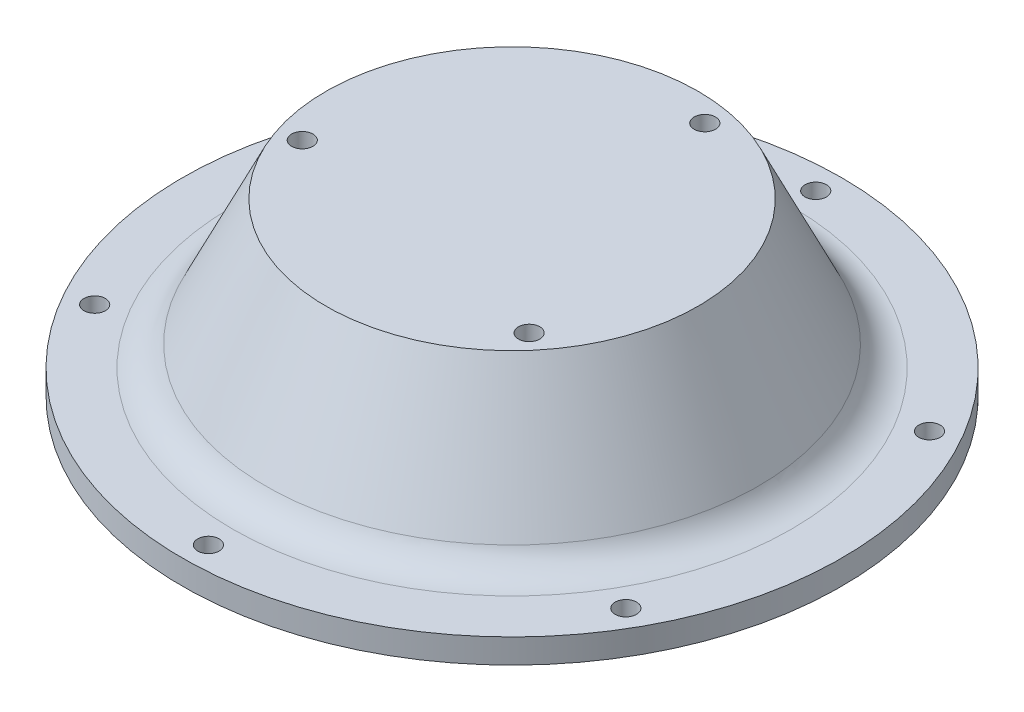
ISO-10303-21;
HEADER;
FILE_DESCRIPTION(('STEP AP214'),'2;1');
FILE_NAME('part.step','',(''),(''),'','','');
FILE_SCHEMA(('AUTOMOTIVE_DESIGN { 1 0 10303 214 1 1 1 1 }'));
ENDSEC;
DATA;
#1=APPLICATION_CONTEXT('core data for automotive mechanical design processes');
#2=APPLICATION_PROTOCOL_DEFINITION('international standard','automotive_design',2000,#1);
#3=PRODUCT_CONTEXT('',#1,'mechanical');
#4=PRODUCT('Part','Part','',(#3));
#5=PRODUCT_RELATED_PRODUCT_CATEGORY('part','',(#4));
#6=PRODUCT_DEFINITION_FORMATION('','',#4);
#7=PRODUCT_DEFINITION_CONTEXT('part definition',#1,'design');
#8=PRODUCT_DEFINITION('design','',#6,#7);
#9=PRODUCT_DEFINITION_SHAPE('','',#8);
#10=(LENGTH_UNIT() NAMED_UNIT(*) SI_UNIT(.MILLI.,.METRE.));
#11=(NAMED_UNIT(*) PLANE_ANGLE_UNIT() SI_UNIT($,.RADIAN.));
#12=(NAMED_UNIT(*) SI_UNIT($,.STERADIAN.) SOLID_ANGLE_UNIT());
#13=UNCERTAINTY_MEASURE_WITH_UNIT(LENGTH_MEASURE(1.E-05),#10,'distance_accuracy_value','');
#14=(GEOMETRIC_REPRESENTATION_CONTEXT(3) GLOBAL_UNCERTAINTY_ASSIGNED_CONTEXT((#13)) GLOBAL_UNIT_ASSIGNED_CONTEXT((#10,
#11,#12)) REPRESENTATION_CONTEXT('',''));
#15=CARTESIAN_POINT('',(0.,0.,0.));
#16=DIRECTION('',(0.,0.,1.));
#17=DIRECTION('',(1.,0.,0.));
#18=AXIS2_PLACEMENT_3D('',#15,#16,#17);
#19=CARTESIAN_POINT('',(42.,24.,0.));
#20=DIRECTION('',(0.,-1.,0.));
#21=DIRECTION('',(0.,0.,-1.));
#22=AXIS2_PLACEMENT_3D('',#19,#20,#21);
#23=CONICAL_SURFACE('',#22,30.5,0.446842468485764);
#24=CARTESIAN_POINT('',(42.,3.40727891741668,0.));
#25=DIRECTION('',(0.,-1.,0.));
#26=DIRECTION('',(0.,0.,-1.));
#27=AXIS2_PLACEMENT_3D('',#24,#25,#26);
#28=CIRCLE('',#27,40.3673455187378);
#29=CARTESIAN_POINT('',(42.,3.40727891741668,-40.3673455187378));
#30=VERTEX_POINT('',#29);
#31=EDGE_CURVE('E10',#30,#30,#28,.F.);
#32=ORIENTED_EDGE('',*,*,#31,.T.);
#33=EDGE_LOOP('',(#32));
#34=FACE_BOUND('',#33,.T.);
#35=CARTESIAN_POINT('',(42.,24.,0.));
#36=DIRECTION('',(0.,-1.,0.));
#37=DIRECTION('',(0.,0.,-1.));
#38=AXIS2_PLACEMENT_3D('',#35,#36,#37);
#39=CIRCLE('',#38,30.5);
#40=CARTESIAN_POINT('',(42.,24.,-30.5));
#41=VERTEX_POINT('',#40);
#42=EDGE_CURVE('E44',#41,#41,#39,.T.);
#43=ORIENTED_EDGE('',*,*,#42,.T.);
#44=EDGE_LOOP('',(#43));
#45=FACE_BOUND('',#44,.T.);
#46=ADVANCED_FACE('F31',(#34,#45),#23,.T.);
#47=CARTESIAN_POINT('',(42.,24.,0.));
#48=DIRECTION('',(0.,-1.,0.));
#49=DIRECTION('',(0.,0.,-1.));
#50=AXIS2_PLACEMENT_3D('',#47,#48,#49);
#51=PLANE('',#50);
#52=CARTESIAN_POINT('',(16.5017606514193,24.,8.87917733365499));
#53=DIRECTION('',(0.,1.,0.));
#54=DIRECTION('',(0.,0.,1.));
#55=AXIS2_PLACEMENT_3D('',#52,#53,#54);
#56=CIRCLE('',#55,1.74999999999893);
#57=CARTESIAN_POINT('',(16.5017606514193,24.,10.6291773336539));
#58=VERTEX_POINT('',#57);
#59=EDGE_CURVE('E51',#58,#58,#56,.T.);
#60=ORIENTED_EDGE('',*,*,#59,.F.);
#61=EDGE_LOOP('',(#60));
#62=FACE_BOUND('',#61,.T.);
#63=CARTESIAN_POINT('',(62.4387128099426,24.,17.6425343608193));
#64=DIRECTION('',(0.,1.,0.));
#65=DIRECTION('',(0.,0.,1.));
#66=AXIS2_PLACEMENT_3D('',#63,#64,#65);
#67=CIRCLE('',#66,1.74999999999946);
#68=CARTESIAN_POINT('',(62.4387128099426,24.,19.3925343608188));
#69=VERTEX_POINT('',#68);
#70=EDGE_CURVE('E171',#69,#69,#67,.T.);
#71=ORIENTED_EDGE('',*,*,#70,.F.);
#72=EDGE_LOOP('',(#71));
#73=FACE_BOUND('',#72,.T.);
#74=CARTESIAN_POINT('',(47.0595265386382,24.,-26.5217116944743));
#75=DIRECTION('',(0.,1.,0.));
#76=DIRECTION('',(0.,0.,1.));
#77=AXIS2_PLACEMENT_3D('',#74,#75,#76);
#78=CIRCLE('',#77,1.75);
#79=CARTESIAN_POINT('',(47.0595265386382,24.,-24.7717116944743));
#80=VERTEX_POINT('',#79);
#81=EDGE_CURVE('E168',#80,#80,#78,.T.);
#82=ORIENTED_EDGE('',*,*,#81,.F.);
#83=EDGE_LOOP('',(#82));
#84=FACE_BOUND('',#83,.T.);
#85=ORIENTED_EDGE('',*,*,#42,.F.);
#86=EDGE_LOOP('',(#85));
#87=FACE_BOUND('',#86,.T.);
#88=ADVANCED_FACE('F71',(#62,#73,#84,#87),#51,.F.);
#89=CARTESIAN_POINT('',(42.,-4.,0.));
#90=DIRECTION('',(0.,1.,0.));
#91=DIRECTION('',(0.,0.,1.));
#92=AXIS2_PLACEMENT_3D('',#89,#90,#91);
#93=CYLINDRICAL_SURFACE('',#92,54.);
#94=CARTESIAN_POINT('',(42.,-4.,0.));
#95=DIRECTION('',(0.,-1.,0.));
#96=DIRECTION('',(0.,0.,-1.));
#97=AXIS2_PLACEMENT_3D('',#94,#95,#96);
#98=CIRCLE('',#97,54.);
#99=CARTESIAN_POINT('',(42.,-4.,-54.));
#100=VERTEX_POINT('',#99);
#101=EDGE_CURVE('E60',#100,#100,#98,.T.);
#102=ORIENTED_EDGE('',*,*,#101,.F.);
#103=EDGE_LOOP('',(#102));
#104=FACE_BOUND('',#103,.T.);
#105=CARTESIAN_POINT('',(42.,0.,0.));
#106=DIRECTION('',(0.,-1.,0.));
#107=DIRECTION('',(0.,0.,-1.));
#108=AXIS2_PLACEMENT_3D('',#105,#106,#107);
#109=CIRCLE('',#108,54.);
#110=CARTESIAN_POINT('',(42.,0.,-54.));
#111=VERTEX_POINT('',#110);
#112=EDGE_CURVE('E56',#111,#111,#109,.T.);
#113=ORIENTED_EDGE('',*,*,#112,.T.);
#114=EDGE_LOOP('',(#113));
#115=FACE_BOUND('',#114,.T.);
#116=ADVANCED_FACE('F73',(#104,#115),#93,.T.);
#117=CARTESIAN_POINT('',(42.,-4.,0.));
#118=DIRECTION('',(0.,-1.,0.));
#119=DIRECTION('',(0.,0.,-1.));
#120=AXIS2_PLACEMENT_3D('',#117,#118,#119);
#121=PLANE('',#120);
#122=CARTESIAN_POINT('',(42.2469349072914,-4.,49.9993902277974));
#123=DIRECTION('',(0.,-1.,0.));
#124=DIRECTION('',(0.,0.,-1.));
#125=AXIS2_PLACEMENT_3D('',#122,#123,#124);
#126=CIRCLE('',#125,1.75);
#127=CARTESIAN_POINT('',(42.2469349072914,-4.,48.2493902277974));
#128=VERTEX_POINT('',#127);
#129=EDGE_CURVE('E131',#128,#128,#126,.T.);
#130=ORIENTED_EDGE('',*,*,#129,.F.);
#131=EDGE_LOOP('',(#130));
#132=FACE_BOUND('',#131,.T.);
#133=CARTESIAN_POINT('',(85.4242095646497,-4.,24.7858432111031));
#134=DIRECTION('',(0.,-1.,0.));
#135=DIRECTION('',(0.,0.,-1.));
#136=AXIS2_PLACEMENT_3D('',#133,#134,#135);
#137=CIRCLE('',#136,1.75);
#138=CARTESIAN_POINT('',(85.4242095646497,-4.,23.0358432111031));
#139=VERTEX_POINT('',#138);
#140=EDGE_CURVE('E164',#139,#139,#137,.T.);
#141=ORIENTED_EDGE('',*,*,#140,.F.);
#142=EDGE_LOOP('',(#141));
#143=FACE_BOUND('',#142,.T.);
#144=CARTESIAN_POINT('',(85.1772746573583,-4.,-25.2135470166943));
#145=DIRECTION('',(0.,-1.,0.));
#146=DIRECTION('',(0.,0.,-1.));
#147=AXIS2_PLACEMENT_3D('',#144,#145,#146);
#148=CIRCLE('',#147,1.75);
#149=CARTESIAN_POINT('',(85.1772746573583,-4.,-26.9635470166943));
#150=VERTEX_POINT('',#149);
#151=EDGE_CURVE('E161',#150,#150,#148,.T.);
#152=ORIENTED_EDGE('',*,*,#151,.F.);
#153=EDGE_LOOP('',(#152));
#154=FACE_BOUND('',#153,.T.);
#155=CARTESIAN_POINT('',(41.7530650927086,-4.,-49.9993902277974));
#156=DIRECTION('',(0.,-1.,0.));
#157=DIRECTION('',(0.,0.,-1.));
#158=AXIS2_PLACEMENT_3D('',#155,#156,#157);
#159=CIRCLE('',#158,1.75);
#160=CARTESIAN_POINT('',(41.7530650927086,-4.,-51.7493902277974));
#161=VERTEX_POINT('',#160);
#162=EDGE_CURVE('E158',#161,#161,#159,.T.);
#163=ORIENTED_EDGE('',*,*,#162,.F.);
#164=EDGE_LOOP('',(#163));
#165=FACE_BOUND('',#164,.T.);
#166=CARTESIAN_POINT('',(-1.42420956464967,-4.,-24.7858432111032));
#167=DIRECTION('',(0.,-1.,0.));
#168=DIRECTION('',(0.,0.,-1.));
#169=AXIS2_PLACEMENT_3D('',#166,#167,#168);
#170=CIRCLE('',#169,1.75);
#171=CARTESIAN_POINT('',(-1.42420956464967,-4.,-26.5358432111032));
#172=VERTEX_POINT('',#171);
#173=EDGE_CURVE('E139',#172,#172,#170,.T.);
#174=ORIENTED_EDGE('',*,*,#173,.F.);
#175=EDGE_LOOP('',(#174));
#176=FACE_BOUND('',#175,.T.);
#177=CARTESIAN_POINT('',(-1.17727465735823,-4.,25.2135470166942));
#178=DIRECTION('',(0.,-1.,0.));
#179=DIRECTION('',(0.,0.,-1.));
#180=AXIS2_PLACEMENT_3D('',#177,#178,#179);
#181=CIRCLE('',#180,1.75);
#182=CARTESIAN_POINT('',(-1.17727465735823,-4.,23.4635470166942));
#183=VERTEX_POINT('',#182);
#184=EDGE_CURVE('E135',#183,#183,#181,.T.);
#185=ORIENTED_EDGE('',*,*,#184,.F.);
#186=EDGE_LOOP('',(#185));
#187=FACE_BOUND('',#186,.T.);
#188=CARTESIAN_POINT('',(16.5017606514193,-4.,8.87917733365499));
#189=DIRECTION('',(0.,-1.,0.));
#190=DIRECTION('',(0.,0.,-1.));
#191=AXIS2_PLACEMENT_3D('',#188,#189,#190);
#192=CIRCLE('',#191,1.74999999999893);
#193=CARTESIAN_POINT('',(16.5017606514193,-4.,7.12917733365606));
#194=VERTEX_POINT('',#193);
#195=EDGE_CURVE('E35',#194,#194,#192,.T.);
#196=ORIENTED_EDGE('',*,*,#195,.F.);
#197=EDGE_LOOP('',(#196));
#198=FACE_BOUND('',#197,.T.);
#199=CARTESIAN_POINT('',(62.4387128099426,-4.,17.6425343608193));
#200=DIRECTION('',(0.,-1.,0.));
#201=DIRECTION('',(0.,0.,-1.));
#202=AXIS2_PLACEMENT_3D('',#199,#200,#201);
#203=CIRCLE('',#202,1.74999999999946);
#204=CARTESIAN_POINT('',(62.4387128099426,-4.,15.8925343608199));
#205=VERTEX_POINT('',#204);
#206=EDGE_CURVE('E50',#205,#205,#203,.T.);
#207=ORIENTED_EDGE('',*,*,#206,.F.);
#208=EDGE_LOOP('',(#207));
#209=FACE_BOUND('',#208,.T.);
#210=CARTESIAN_POINT('',(47.0595265386382,-4.,-26.5217116944743));
#211=DIRECTION('',(0.,-1.,0.));
#212=DIRECTION('',(0.,0.,-1.));
#213=AXIS2_PLACEMENT_3D('',#210,#211,#212);
#214=CIRCLE('',#213,1.75);
#215=CARTESIAN_POINT('',(47.0595265386382,-4.,-28.2717116944743));
#216=VERTEX_POINT('',#215);
#217=EDGE_CURVE('E48',#216,#216,#214,.T.);
#218=ORIENTED_EDGE('',*,*,#217,.F.);
#219=EDGE_LOOP('',(#218));
#220=FACE_BOUND('',#219,.T.);
#221=ORIENTED_EDGE('',*,*,#101,.T.);
#222=EDGE_LOOP('',(#221));
#223=FACE_BOUND('',#222,.T.);
#224=ADVANCED_FACE('F80',(#132,#143,#154,#165,#176,#187,#198,#209,#220,#223),#121,.T.);
#225=CARTESIAN_POINT('',(42.,0.,0.));
#226=DIRECTION('',(0.,-1.,0.));
#227=DIRECTION('',(0.,0.,-1.));
#228=AXIS2_PLACEMENT_3D('',#225,#226,#227);
#229=PLANE('',#228);
#230=CARTESIAN_POINT('',(42.2469349072914,0.,49.9993902277974));
#231=DIRECTION('',(0.,1.,0.));
#232=DIRECTION('',(0.,0.,1.));
#233=AXIS2_PLACEMENT_3D('',#230,#231,#232);
#234=CIRCLE('',#233,1.75);
#235=CARTESIAN_POINT('',(42.2469349072914,0.,51.7493902277974));
#236=VERTEX_POINT('',#235);
#237=EDGE_CURVE('E134',#236,#236,#234,.T.);
#238=ORIENTED_EDGE('',*,*,#237,.F.);
#239=EDGE_LOOP('',(#238));
#240=FACE_BOUND('',#239,.T.);
#241=CARTESIAN_POINT('',(85.4242095646497,0.,24.7858432111031));
#242=DIRECTION('',(0.,1.,0.));
#243=DIRECTION('',(0.,0.,1.));
#244=AXIS2_PLACEMENT_3D('',#241,#242,#243);
#245=CIRCLE('',#244,1.75);
#246=CARTESIAN_POINT('',(85.4242095646497,0.,26.5358432111031));
#247=VERTEX_POINT('',#246);
#248=EDGE_CURVE('E145',#247,#247,#245,.T.);
#249=ORIENTED_EDGE('',*,*,#248,.F.);
#250=EDGE_LOOP('',(#249));
#251=FACE_BOUND('',#250,.T.);
#252=CARTESIAN_POINT('',(85.1772746573583,0.,-25.2135470166943));
#253=DIRECTION('',(0.,1.,0.));
#254=DIRECTION('',(0.,0.,1.));
#255=AXIS2_PLACEMENT_3D('',#252,#253,#254);
#256=CIRCLE('',#255,1.75);
#257=CARTESIAN_POINT('',(85.1772746573583,0.,-23.4635470166943));
#258=VERTEX_POINT('',#257);
#259=EDGE_CURVE('E147',#258,#258,#256,.T.);
#260=ORIENTED_EDGE('',*,*,#259,.F.);
#261=EDGE_LOOP('',(#260));
#262=FACE_BOUND('',#261,.T.);
#263=CARTESIAN_POINT('',(41.7530650927086,0.,-49.9993902277974));
#264=DIRECTION('',(0.,1.,0.));
#265=DIRECTION('',(0.,0.,1.));
#266=AXIS2_PLACEMENT_3D('',#263,#264,#265);
#267=CIRCLE('',#266,1.75);
#268=CARTESIAN_POINT('',(41.7530650927086,0.,-48.2493902277974));
#269=VERTEX_POINT('',#268);
#270=EDGE_CURVE('E151',#269,#269,#267,.T.);
#271=ORIENTED_EDGE('',*,*,#270,.F.);
#272=EDGE_LOOP('',(#271));
#273=FACE_BOUND('',#272,.T.);
#274=CARTESIAN_POINT('',(-1.42420956464967,0.,-24.7858432111032));
#275=DIRECTION('',(0.,1.,0.));
#276=DIRECTION('',(0.,0.,1.));
#277=AXIS2_PLACEMENT_3D('',#274,#275,#276);
#278=CIRCLE('',#277,1.75);
#279=CARTESIAN_POINT('',(-1.42420956464967,0.,-23.0358432111032));
#280=VERTEX_POINT('',#279);
#281=EDGE_CURVE('E142',#280,#280,#278,.T.);
#282=ORIENTED_EDGE('',*,*,#281,.F.);
#283=EDGE_LOOP('',(#282));
#284=FACE_BOUND('',#283,.T.);
#285=CARTESIAN_POINT('',(-1.17727465735823,0.,25.2135470166942));
#286=DIRECTION('',(0.,1.,0.));
#287=DIRECTION('',(0.,0.,1.));
#288=AXIS2_PLACEMENT_3D('',#285,#286,#287);
#289=CIRCLE('',#288,1.75);
#290=CARTESIAN_POINT('',(-1.17727465735823,0.,26.9635470166942));
#291=VERTEX_POINT('',#290);
#292=EDGE_CURVE('E136',#291,#291,#289,.T.);
#293=ORIENTED_EDGE('',*,*,#292,.F.);
#294=EDGE_LOOP('',(#293));
#295=FACE_BOUND('',#294,.T.);
#296=CARTESIAN_POINT('',(42.,0.,0.));
#297=DIRECTION('',(0.,-1.,0.));
#298=DIRECTION('',(0.,0.,-1.));
#299=AXIS2_PLACEMENT_3D('',#296,#297,#298);
#300=CIRCLE('',#299,45.7782416910856);
#301=CARTESIAN_POINT('',(42.,0.,-45.7782416910856));
#302=VERTEX_POINT('',#301);
#303=EDGE_CURVE('E39',#302,#302,#300,.T.);
#304=ORIENTED_EDGE('',*,*,#303,.T.);
#305=EDGE_LOOP('',(#304));
#306=FACE_BOUND('',#305,.T.);
#307=ORIENTED_EDGE('',*,*,#112,.F.);
#308=EDGE_LOOP('',(#307));
#309=FACE_BOUND('',#308,.T.);
#310=ADVANCED_FACE('F86',(#240,#251,#262,#273,#284,#295,#306,#309),#229,.F.);
#311=CARTESIAN_POINT('',(42.,6.,0.));
#312=DIRECTION('',(0.,-1.,0.));
#313=DIRECTION('',(0.,0.,-1.));
#314=AXIS2_PLACEMENT_3D('',#311,#312,#313);
#315=TOROIDAL_SURFACE('',#314,45.7782416910856,6.);
#316=ORIENTED_EDGE('',*,*,#31,.F.);
#317=EDGE_LOOP('',(#316));
#318=FACE_BOUND('',#317,.T.);
#319=ORIENTED_EDGE('',*,*,#303,.F.);
#320=EDGE_LOOP('',(#319));
#321=FACE_BOUND('',#320,.T.);
#322=ADVANCED_FACE('F33',(#318,#321),#315,.F.);
#323=CARTESIAN_POINT('',(47.0595265386382,-26.,-26.5217116944743));
#324=DIRECTION('',(0.,1.,0.));
#325=DIRECTION('',(0.,0.,1.));
#326=AXIS2_PLACEMENT_3D('',#323,#324,#325);
#327=CYLINDRICAL_SURFACE('',#326,1.75);
#328=ORIENTED_EDGE('',*,*,#217,.T.);
#329=EDGE_LOOP('',(#328));
#330=FACE_BOUND('',#329,.T.);
#331=ORIENTED_EDGE('',*,*,#81,.T.);
#332=EDGE_LOOP('',(#331));
#333=FACE_BOUND('',#332,.T.);
#334=ADVANCED_FACE('F93',(#330,#333),#327,.F.);
#335=CARTESIAN_POINT('',(62.4387128099426,-26.,17.6425343608193));
#336=DIRECTION('',(0.,1.,0.));
#337=DIRECTION('',(0.,0.,1.));
#338=AXIS2_PLACEMENT_3D('',#335,#336,#337);
#339=CYLINDRICAL_SURFACE('',#338,1.74999999999946);
#340=ORIENTED_EDGE('',*,*,#206,.T.);
#341=EDGE_LOOP('',(#340));
#342=FACE_BOUND('',#341,.T.);
#343=ORIENTED_EDGE('',*,*,#70,.T.);
#344=EDGE_LOOP('',(#343));
#345=FACE_BOUND('',#344,.T.);
#346=ADVANCED_FACE('F96',(#342,#345),#339,.F.);
#347=CARTESIAN_POINT('',(16.5017606514193,-26.,8.87917733365499));
#348=DIRECTION('',(0.,1.,0.));
#349=DIRECTION('',(0.,0.,1.));
#350=AXIS2_PLACEMENT_3D('',#347,#348,#349);
#351=CYLINDRICAL_SURFACE('',#350,1.74999999999893);
#352=ORIENTED_EDGE('',*,*,#195,.T.);
#353=EDGE_LOOP('',(#352));
#354=FACE_BOUND('',#353,.T.);
#355=ORIENTED_EDGE('',*,*,#59,.T.);
#356=EDGE_LOOP('',(#355));
#357=FACE_BOUND('',#356,.T.);
#358=ADVANCED_FACE('F100',(#354,#357),#351,.F.);
#359=CARTESIAN_POINT('',(-1.17727465735823,-50.,25.2135470166942));
#360=DIRECTION('',(0.,1.,0.));
#361=DIRECTION('',(0.,0.,1.));
#362=AXIS2_PLACEMENT_3D('',#359,#360,#361);
#363=CYLINDRICAL_SURFACE('',#362,1.75);
#364=ORIENTED_EDGE('',*,*,#184,.T.);
#365=EDGE_LOOP('',(#364));
#366=FACE_BOUND('',#365,.T.);
#367=ORIENTED_EDGE('',*,*,#292,.T.);
#368=EDGE_LOOP('',(#367));
#369=FACE_BOUND('',#368,.T.);
#370=ADVANCED_FACE('F103',(#366,#369),#363,.F.);
#371=CARTESIAN_POINT('',(-1.42420956464967,-50.,-24.7858432111032));
#372=DIRECTION('',(0.,1.,0.));
#373=DIRECTION('',(0.,0.,1.));
#374=AXIS2_PLACEMENT_3D('',#371,#372,#373);
#375=CYLINDRICAL_SURFACE('',#374,1.75);
#376=ORIENTED_EDGE('',*,*,#173,.T.);
#377=EDGE_LOOP('',(#376));
#378=FACE_BOUND('',#377,.T.);
#379=ORIENTED_EDGE('',*,*,#281,.T.);
#380=EDGE_LOOP('',(#379));
#381=FACE_BOUND('',#380,.T.);
#382=ADVANCED_FACE('F112',(#378,#381),#375,.F.);
#383=CARTESIAN_POINT('',(41.7530650927086,-50.,-49.9993902277974));
#384=DIRECTION('',(0.,1.,0.));
#385=DIRECTION('',(0.,0.,1.));
#386=AXIS2_PLACEMENT_3D('',#383,#384,#385);
#387=CYLINDRICAL_SURFACE('',#386,1.75);
#388=ORIENTED_EDGE('',*,*,#162,.T.);
#389=EDGE_LOOP('',(#388));
#390=FACE_BOUND('',#389,.T.);
#391=ORIENTED_EDGE('',*,*,#270,.T.);
#392=EDGE_LOOP('',(#391));
#393=FACE_BOUND('',#392,.T.);
#394=ADVANCED_FACE('F108',(#390,#393),#387,.F.);
#395=CARTESIAN_POINT('',(85.1772746573583,-50.,-25.2135470166943));
#396=DIRECTION('',(0.,1.,0.));
#397=DIRECTION('',(0.,0.,1.));
#398=AXIS2_PLACEMENT_3D('',#395,#396,#397);
#399=CYLINDRICAL_SURFACE('',#398,1.75);
#400=ORIENTED_EDGE('',*,*,#151,.T.);
#401=EDGE_LOOP('',(#400));
#402=FACE_BOUND('',#401,.T.);
#403=ORIENTED_EDGE('',*,*,#259,.T.);
#404=EDGE_LOOP('',(#403));
#405=FACE_BOUND('',#404,.T.);
#406=ADVANCED_FACE('F104',(#402,#405),#399,.F.);
#407=CARTESIAN_POINT('',(85.4242095646497,-50.,24.7858432111031));
#408=DIRECTION('',(0.,1.,0.));
#409=DIRECTION('',(0.,0.,1.));
#410=AXIS2_PLACEMENT_3D('',#407,#408,#409);
#411=CYLINDRICAL_SURFACE('',#410,1.75);
#412=ORIENTED_EDGE('',*,*,#140,.T.);
#413=EDGE_LOOP('',(#412));
#414=FACE_BOUND('',#413,.T.);
#415=ORIENTED_EDGE('',*,*,#248,.T.);
#416=EDGE_LOOP('',(#415));
#417=FACE_BOUND('',#416,.T.);
#418=ADVANCED_FACE('F107',(#414,#417),#411,.F.);
#419=CARTESIAN_POINT('',(42.2469349072914,-50.,49.9993902277974));
#420=DIRECTION('',(0.,1.,0.));
#421=DIRECTION('',(0.,0.,1.));
#422=AXIS2_PLACEMENT_3D('',#419,#420,#421);
#423=CYLINDRICAL_SURFACE('',#422,1.75);
#424=ORIENTED_EDGE('',*,*,#129,.T.);
#425=EDGE_LOOP('',(#424));
#426=FACE_BOUND('',#425,.T.);
#427=ORIENTED_EDGE('',*,*,#237,.T.);
#428=EDGE_LOOP('',(#427));
#429=FACE_BOUND('',#428,.T.);
#430=ADVANCED_FACE('F122',(#426,#429),#423,.F.);
#431=CLOSED_SHELL('',(#46,#88,#116,#224,#310,#322,#334,#346,#358,#370,#382,#394,#406,#418,#430));
#432=MANIFOLD_SOLID_BREP('B2',#431);
#433=ADVANCED_BREP_SHAPE_REPRESENTATION('',(#18,#432),#14);
#434=SHAPE_DEFINITION_REPRESENTATION(#9,#433);
ENDSEC;
END-ISO-10303-21;
